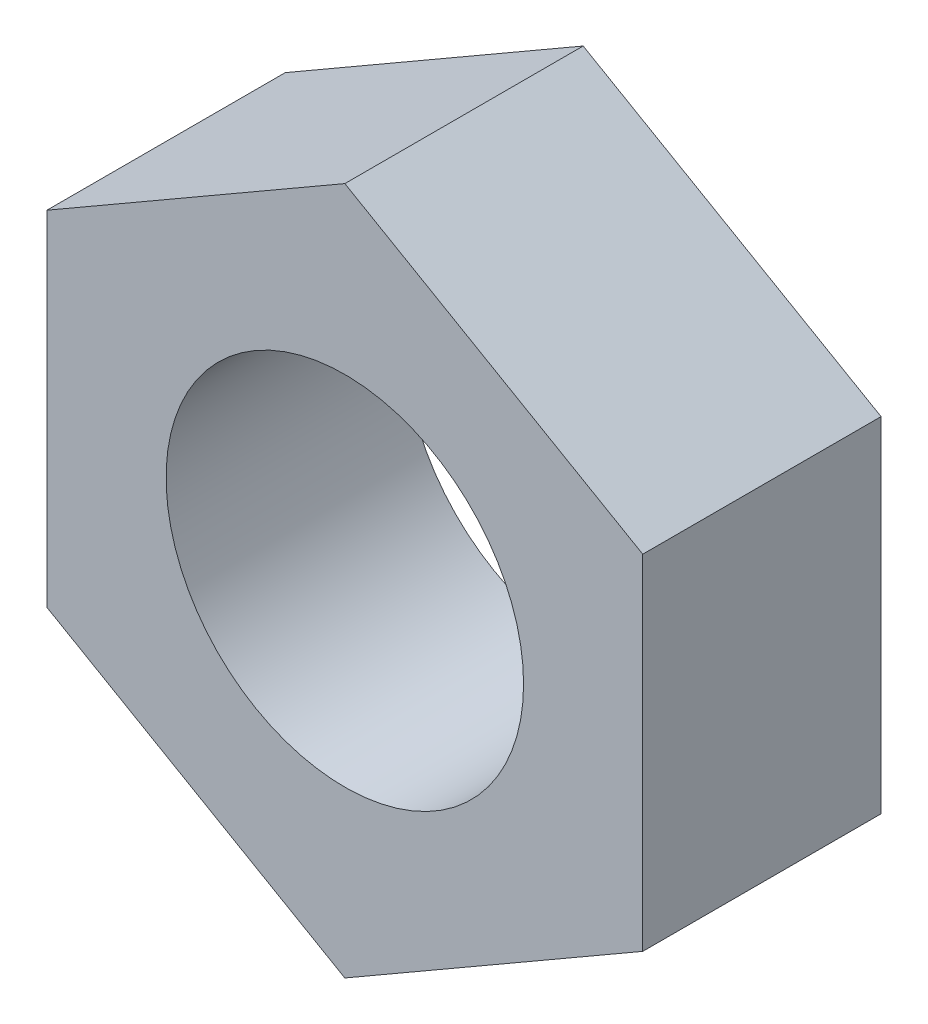
ISO-10303-21;
HEADER;
FILE_DESCRIPTION(('STEP AP214'),'2;1');
FILE_NAME('part.step','',(''),(''),'','','');
FILE_SCHEMA(('AUTOMOTIVE_DESIGN { 1 0 10303 214 1 1 1 1 }'));
ENDSEC;
DATA;
#1=APPLICATION_CONTEXT('core data for automotive mechanical design processes');
#2=APPLICATION_PROTOCOL_DEFINITION('international standard','automotive_design',2000,#1);
#3=PRODUCT_CONTEXT('',#1,'mechanical');
#4=PRODUCT('Part','Part','',(#3));
#5=PRODUCT_RELATED_PRODUCT_CATEGORY('part','',(#4));
#6=PRODUCT_DEFINITION_FORMATION('','',#4);
#7=PRODUCT_DEFINITION_CONTEXT('part definition',#1,'design');
#8=PRODUCT_DEFINITION('design','',#6,#7);
#9=PRODUCT_DEFINITION_SHAPE('','',#8);
#10=(LENGTH_UNIT() NAMED_UNIT(*) SI_UNIT(.MILLI.,.METRE.));
#11=(NAMED_UNIT(*) PLANE_ANGLE_UNIT() SI_UNIT($,.RADIAN.));
#12=(NAMED_UNIT(*) SI_UNIT($,.STERADIAN.) SOLID_ANGLE_UNIT());
#13=UNCERTAINTY_MEASURE_WITH_UNIT(LENGTH_MEASURE(1.E-05),#10,'distance_accuracy_value','');
#14=(GEOMETRIC_REPRESENTATION_CONTEXT(3) GLOBAL_UNCERTAINTY_ASSIGNED_CONTEXT((#13)) GLOBAL_UNIT_ASSIGNED_CONTEXT((#10,
#11,#12)) REPRESENTATION_CONTEXT('',''));
#15=CARTESIAN_POINT('',(0.,0.,0.));
#16=DIRECTION('',(0.,0.,1.));
#17=DIRECTION('',(1.,0.,0.));
#18=AXIS2_PLACEMENT_3D('',#15,#16,#17);
#19=CARTESIAN_POINT('',(0.,0.,2.));
#20=DIRECTION('',(0.,0.,1.));
#21=DIRECTION('',(1.,0.,0.));
#22=AXIS2_PLACEMENT_3D('',#19,#20,#21);
#23=PLANE('',#22);
#24=DIRECTION('',(-0.866025403784439,0.5,0.));
#25=VECTOR('',#24,1.);
#26=CARTESIAN_POINT('',(2.5,1.44337567297406,2.));
#27=LINE('',#26,#25);
#28=CARTESIAN_POINT('',(2.5,1.44337567297406,2.));
#29=VERTEX_POINT('',#28);
#30=CARTESIAN_POINT('',(0.,2.88675134594812,2.));
#31=VERTEX_POINT('',#30);
#32=EDGE_CURVE('E146',#29,#31,#27,.T.);
#33=ORIENTED_EDGE('',*,*,#32,.T.);
#34=DIRECTION('',(-0.866025403784439,-0.499999999999999,0.));
#35=VECTOR('',#34,1.);
#36=CARTESIAN_POINT('',(0.,2.88675134594812,2.));
#37=LINE('',#36,#35);
#38=CARTESIAN_POINT('',(-2.50000000000001,1.44337567297406,2.));
#39=VERTEX_POINT('',#38);
#40=EDGE_CURVE('E94',#31,#39,#37,.T.);
#41=ORIENTED_EDGE('',*,*,#40,.T.);
#42=DIRECTION('',(0.,-1.,0.));
#43=VECTOR('',#42,1.);
#44=CARTESIAN_POINT('',(-2.50000000000001,1.44337567297406,2.));
#45=LINE('',#44,#43);
#46=CARTESIAN_POINT('',(-2.50000000000001,-1.44337567297408,2.));
#47=VERTEX_POINT('',#46);
#48=EDGE_CURVE('E107',#39,#47,#45,.T.);
#49=ORIENTED_EDGE('',*,*,#48,.T.);
#50=DIRECTION('',(0.866025403784439,-0.5,0.));
#51=VECTOR('',#50,1.);
#52=CARTESIAN_POINT('',(-2.50000000000001,-1.44337567297408,2.));
#53=LINE('',#52,#51);
#54=CARTESIAN_POINT('',(0.,-2.88675134594814,2.));
#55=VERTEX_POINT('',#54);
#56=EDGE_CURVE('E101',#47,#55,#53,.T.);
#57=ORIENTED_EDGE('',*,*,#56,.T.);
#58=DIRECTION('',(0.866025403784439,0.5,0.));
#59=VECTOR('',#58,1.);
#60=CARTESIAN_POINT('',(0.,-2.88675134594814,2.));
#61=LINE('',#60,#59);
#62=CARTESIAN_POINT('',(2.5,-1.44337567297407,2.));
#63=VERTEX_POINT('',#62);
#64=EDGE_CURVE('E105',#55,#63,#61,.T.);
#65=ORIENTED_EDGE('',*,*,#64,.T.);
#66=DIRECTION('',(0.,1.,0.));
#67=VECTOR('',#66,1.);
#68=CARTESIAN_POINT('',(2.5,-1.44337567297407,2.));
#69=LINE('',#68,#67);
#70=EDGE_CURVE('E57',#63,#29,#69,.T.);
#71=ORIENTED_EDGE('',*,*,#70,.T.);
#72=EDGE_LOOP('',(#33,#41,#49,#57,#65,#71));
#73=FACE_BOUND('',#72,.T.);
#74=CARTESIAN_POINT('',(0.,0.,2.));
#75=DIRECTION('',(0.,0.,1.));
#76=DIRECTION('',(1.,0.,0.));
#77=AXIS2_PLACEMENT_3D('',#74,#75,#76);
#78=CIRCLE('',#77,1.5);
#79=CARTESIAN_POINT('',(1.5,0.,2.));
#80=VERTEX_POINT('',#79);
#81=EDGE_CURVE('E134',#80,#80,#78,.T.);
#82=ORIENTED_EDGE('',*,*,#81,.F.);
#83=EDGE_LOOP('',(#82));
#84=FACE_BOUND('',#83,.T.);
#85=ADVANCED_FACE('F39',(#73,#84),#23,.T.);
#86=CARTESIAN_POINT('',(0.,0.,0.));
#87=DIRECTION('',(0.,0.,1.));
#88=DIRECTION('',(1.,0.,0.));
#89=AXIS2_PLACEMENT_3D('',#86,#87,#88);
#90=PLANE('',#89);
#91=DIRECTION('',(-0.866025403784439,0.5,0.));
#92=VECTOR('',#91,1.);
#93=CARTESIAN_POINT('',(2.5,1.44337567297406,0.));
#94=LINE('',#93,#92);
#95=CARTESIAN_POINT('',(2.5,1.44337567297406,0.));
#96=VERTEX_POINT('',#95);
#97=CARTESIAN_POINT('',(0.,2.88675134594812,0.));
#98=VERTEX_POINT('',#97);
#99=EDGE_CURVE('E129',#96,#98,#94,.T.);
#100=ORIENTED_EDGE('',*,*,#99,.F.);
#101=DIRECTION('',(0.,1.,0.));
#102=VECTOR('',#101,1.);
#103=CARTESIAN_POINT('',(2.5,-1.44337567297407,0.));
#104=LINE('',#103,#102);
#105=CARTESIAN_POINT('',(2.5,-1.44337567297407,0.));
#106=VERTEX_POINT('',#105);
#107=EDGE_CURVE('E86',#106,#96,#104,.T.);
#108=ORIENTED_EDGE('',*,*,#107,.F.);
#109=DIRECTION('',(0.866025403784439,0.5,0.));
#110=VECTOR('',#109,1.);
#111=CARTESIAN_POINT('',(0.,-2.88675134594814,0.));
#112=LINE('',#111,#110);
#113=CARTESIAN_POINT('',(0.,-2.88675134594814,0.));
#114=VERTEX_POINT('',#113);
#115=EDGE_CURVE('E80',#114,#106,#112,.T.);
#116=ORIENTED_EDGE('',*,*,#115,.F.);
#117=DIRECTION('',(0.866025403784439,-0.5,0.));
#118=VECTOR('',#117,1.);
#119=CARTESIAN_POINT('',(-2.50000000000001,-1.44337567297408,0.));
#120=LINE('',#119,#118);
#121=CARTESIAN_POINT('',(-2.50000000000001,-1.44337567297408,0.));
#122=VERTEX_POINT('',#121);
#123=EDGE_CURVE('E116',#122,#114,#120,.T.);
#124=ORIENTED_EDGE('',*,*,#123,.F.);
#125=DIRECTION('',(0.,-1.,0.));
#126=VECTOR('',#125,1.);
#127=CARTESIAN_POINT('',(-2.50000000000001,1.44337567297406,0.));
#128=LINE('',#127,#126);
#129=CARTESIAN_POINT('',(-2.50000000000001,1.44337567297406,0.));
#130=VERTEX_POINT('',#129);
#131=EDGE_CURVE('E137',#130,#122,#128,.T.);
#132=ORIENTED_EDGE('',*,*,#131,.F.);
#133=DIRECTION('',(-0.866025403784439,-0.499999999999999,0.));
#134=VECTOR('',#133,1.);
#135=CARTESIAN_POINT('',(0.,2.88675134594812,0.));
#136=LINE('',#135,#134);
#137=EDGE_CURVE('E133',#98,#130,#136,.T.);
#138=ORIENTED_EDGE('',*,*,#137,.F.);
#139=EDGE_LOOP('',(#100,#108,#116,#124,#132,#138));
#140=FACE_BOUND('',#139,.T.);
#141=CARTESIAN_POINT('',(0.,0.,0.));
#142=DIRECTION('',(0.,0.,1.));
#143=DIRECTION('',(1.,0.,0.));
#144=AXIS2_PLACEMENT_3D('',#141,#142,#143);
#145=CIRCLE('',#144,1.5);
#146=CARTESIAN_POINT('',(1.5,0.,0.));
#147=VERTEX_POINT('',#146);
#148=EDGE_CURVE('E243',#147,#147,#145,.T.);
#149=ORIENTED_EDGE('',*,*,#148,.T.);
#150=EDGE_LOOP('',(#149));
#151=FACE_BOUND('',#150,.T.);
#152=ADVANCED_FACE('F159',(#140,#151),#90,.F.);
#153=CARTESIAN_POINT('',(2.5,1.44337567297406,2.));
#154=DIRECTION('',(-0.5,-0.866025403784439,0.));
#155=DIRECTION('',(0.866025403784439,-0.5,0.));
#156=AXIS2_PLACEMENT_3D('',#153,#154,#155);
#157=PLANE('',#156);
#158=ORIENTED_EDGE('',*,*,#99,.T.);
#159=DIRECTION('',(0.,0.,-1.));
#160=VECTOR('',#159,1.);
#161=CARTESIAN_POINT('',(0.,2.88675134594812,2.));
#162=LINE('',#161,#160);
#163=EDGE_CURVE('E11',#31,#98,#162,.T.);
#164=ORIENTED_EDGE('',*,*,#163,.F.);
#165=ORIENTED_EDGE('',*,*,#32,.F.);
#166=DIRECTION('',(0.,0.,-1.));
#167=VECTOR('',#166,1.);
#168=CARTESIAN_POINT('',(2.5,1.44337567297406,2.));
#169=LINE('',#168,#167);
#170=EDGE_CURVE('E125',#29,#96,#169,.T.);
#171=ORIENTED_EDGE('',*,*,#170,.T.);
#172=EDGE_LOOP('',(#158,#164,#165,#171));
#173=FACE_BOUND('',#172,.T.);
#174=ADVANCED_FACE('F41',(#173),#157,.F.);
#175=CARTESIAN_POINT('',(0.,2.88675134594812,2.));
#176=DIRECTION('',(0.5,-0.866025403784439,0.));
#177=DIRECTION('',(0.866025403784439,0.5,0.));
#178=AXIS2_PLACEMENT_3D('',#175,#176,#177);
#179=PLANE('',#178);
#180=ORIENTED_EDGE('',*,*,#137,.T.);
#181=DIRECTION('',(0.,0.,-1.));
#182=VECTOR('',#181,1.);
#183=CARTESIAN_POINT('',(-2.50000000000001,1.44337567297406,2.));
#184=LINE('',#183,#182);
#185=EDGE_CURVE('E49',#39,#130,#184,.T.);
#186=ORIENTED_EDGE('',*,*,#185,.F.);
#187=ORIENTED_EDGE('',*,*,#40,.F.);
#188=ORIENTED_EDGE('',*,*,#163,.T.);
#189=EDGE_LOOP('',(#180,#186,#187,#188));
#190=FACE_BOUND('',#189,.T.);
#191=ADVANCED_FACE('F184',(#190),#179,.F.);
#192=CARTESIAN_POINT('',(-2.50000000000001,1.44337567297406,2.));
#193=DIRECTION('',(1.,0.,0.));
#194=DIRECTION('',(0.,0.,-1.));
#195=AXIS2_PLACEMENT_3D('',#192,#193,#194);
#196=PLANE('',#195);
#197=ORIENTED_EDGE('',*,*,#131,.T.);
#198=DIRECTION('',(0.,0.,-1.));
#199=VECTOR('',#198,1.);
#200=CARTESIAN_POINT('',(-2.50000000000001,-1.44337567297408,2.));
#201=LINE('',#200,#199);
#202=EDGE_CURVE('E118',#47,#122,#201,.T.);
#203=ORIENTED_EDGE('',*,*,#202,.F.);
#204=ORIENTED_EDGE('',*,*,#48,.F.);
#205=ORIENTED_EDGE('',*,*,#185,.T.);
#206=EDGE_LOOP('',(#197,#203,#204,#205));
#207=FACE_BOUND('',#206,.T.);
#208=ADVANCED_FACE('F156',(#207),#196,.F.);
#209=CARTESIAN_POINT('',(-2.50000000000001,-1.44337567297408,2.));
#210=DIRECTION('',(0.499999999999999,0.866025403784439,0.));
#211=DIRECTION('',(-0.866025403784439,0.499999999999999,0.));
#212=AXIS2_PLACEMENT_3D('',#209,#210,#211);
#213=PLANE('',#212);
#214=ORIENTED_EDGE('',*,*,#123,.T.);
#215=DIRECTION('',(0.,0.,-1.));
#216=VECTOR('',#215,1.);
#217=CARTESIAN_POINT('',(0.,-2.88675134594814,2.));
#218=LINE('',#217,#216);
#219=EDGE_CURVE('E113',#55,#114,#218,.T.);
#220=ORIENTED_EDGE('',*,*,#219,.F.);
#221=ORIENTED_EDGE('',*,*,#56,.F.);
#222=ORIENTED_EDGE('',*,*,#202,.T.);
#223=EDGE_LOOP('',(#214,#220,#221,#222));
#224=FACE_BOUND('',#223,.T.);
#225=ADVANCED_FACE('F114',(#224),#213,.F.);
#226=CARTESIAN_POINT('',(0.,-2.88675134594814,2.));
#227=DIRECTION('',(-0.5,0.866025403784439,0.));
#228=DIRECTION('',(-0.866025403784439,-0.5,0.));
#229=AXIS2_PLACEMENT_3D('',#226,#227,#228);
#230=PLANE('',#229);
#231=ORIENTED_EDGE('',*,*,#115,.T.);
#232=DIRECTION('',(0.,0.,-1.));
#233=VECTOR('',#232,1.);
#234=CARTESIAN_POINT('',(2.5,-1.44337567297407,2.));
#235=LINE('',#234,#233);
#236=EDGE_CURVE('E119',#63,#106,#235,.T.);
#237=ORIENTED_EDGE('',*,*,#236,.F.);
#238=ORIENTED_EDGE('',*,*,#64,.F.);
#239=ORIENTED_EDGE('',*,*,#219,.T.);
#240=EDGE_LOOP('',(#231,#237,#238,#239));
#241=FACE_BOUND('',#240,.T.);
#242=ADVANCED_FACE('F121',(#241),#230,.F.);
#243=CARTESIAN_POINT('',(2.5,-1.44337567297407,2.));
#244=DIRECTION('',(-1.,0.,0.));
#245=DIRECTION('',(0.,-1.,0.));
#246=AXIS2_PLACEMENT_3D('',#243,#244,#245);
#247=PLANE('',#246);
#248=ORIENTED_EDGE('',*,*,#107,.T.);
#249=ORIENTED_EDGE('',*,*,#170,.F.);
#250=ORIENTED_EDGE('',*,*,#70,.F.);
#251=ORIENTED_EDGE('',*,*,#236,.T.);
#252=EDGE_LOOP('',(#248,#249,#250,#251));
#253=FACE_BOUND('',#252,.T.);
#254=ADVANCED_FACE('F164',(#253),#247,.F.);
#255=CARTESIAN_POINT('',(0.,0.,2.));
#256=DIRECTION('',(0.,0.,-1.));
#257=DIRECTION('',(-1.,0.,0.));
#258=AXIS2_PLACEMENT_3D('',#255,#256,#257);
#259=CYLINDRICAL_SURFACE('',#258,1.5);
#260=ORIENTED_EDGE('',*,*,#81,.T.);
#261=EDGE_LOOP('',(#260));
#262=FACE_BOUND('',#261,.T.);
#263=ORIENTED_EDGE('',*,*,#148,.F.);
#264=EDGE_LOOP('',(#263));
#265=FACE_BOUND('',#264,.T.);
#266=ADVANCED_FACE('F166',(#262,#265),#259,.F.);
#267=CLOSED_SHELL('',(#85,#152,#174,#191,#208,#225,#242,#254,#266));
#268=MANIFOLD_SOLID_BREP('B2',#267);
#269=ADVANCED_BREP_SHAPE_REPRESENTATION('',(#18,#268),#14);
#270=SHAPE_DEFINITION_REPRESENTATION(#9,#269);
ENDSEC;
END-ISO-10303-21;
